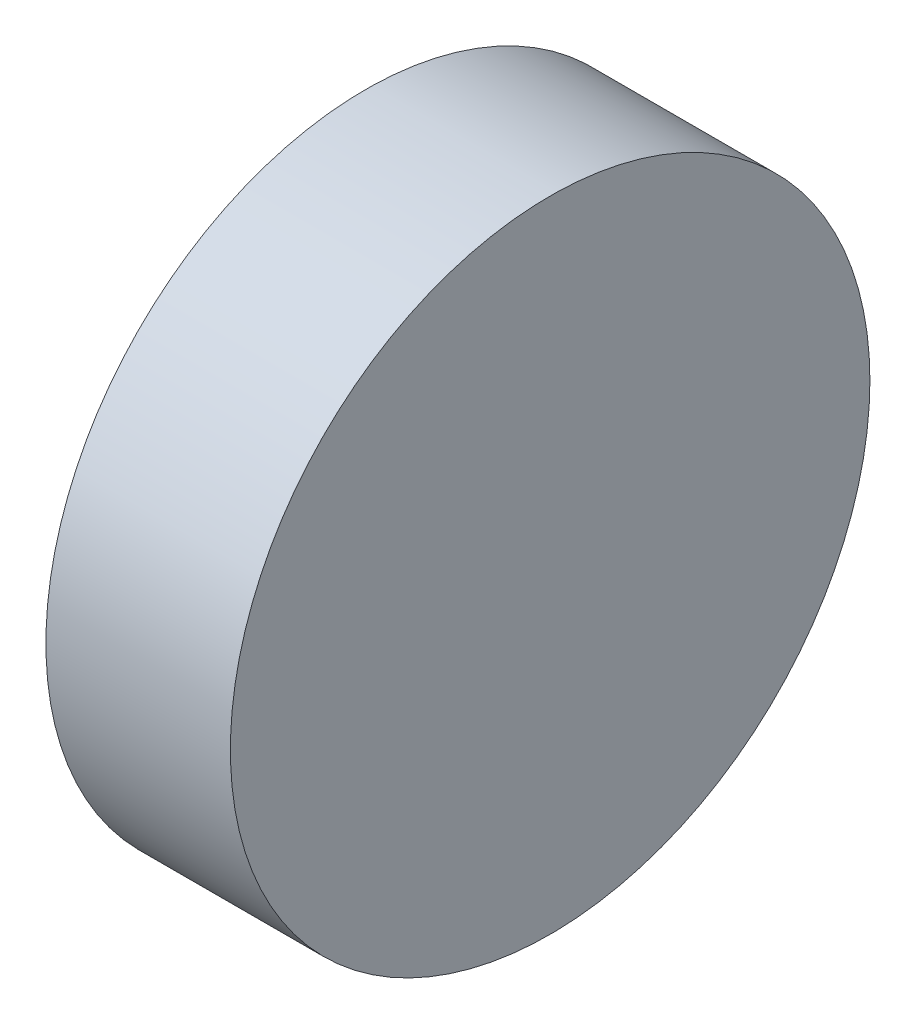
ISO-10303-21;
HEADER;
FILE_DESCRIPTION(('STEP AP214'),'2;1');
FILE_NAME('part.step','',(''),(''),'','','');
FILE_SCHEMA(('AUTOMOTIVE_DESIGN { 1 0 10303 214 1 1 1 1 }'));
ENDSEC;
DATA;
#1=APPLICATION_CONTEXT('core data for automotive mechanical design processes');
#2=APPLICATION_PROTOCOL_DEFINITION('international standard','automotive_design',2000,#1);
#3=PRODUCT_CONTEXT('',#1,'mechanical');
#4=PRODUCT('Part','Part','',(#3));
#5=PRODUCT_RELATED_PRODUCT_CATEGORY('part','',(#4));
#6=PRODUCT_DEFINITION_FORMATION('','',#4);
#7=PRODUCT_DEFINITION_CONTEXT('part definition',#1,'design');
#8=PRODUCT_DEFINITION('design','',#6,#7);
#9=PRODUCT_DEFINITION_SHAPE('','',#8);
#10=(LENGTH_UNIT() NAMED_UNIT(*) SI_UNIT(.MILLI.,.METRE.));
#11=(NAMED_UNIT(*) PLANE_ANGLE_UNIT() SI_UNIT($,.RADIAN.));
#12=(NAMED_UNIT(*) SI_UNIT($,.STERADIAN.) SOLID_ANGLE_UNIT());
#13=UNCERTAINTY_MEASURE_WITH_UNIT(LENGTH_MEASURE(1.E-05),#10,'distance_accuracy_value','');
#14=(GEOMETRIC_REPRESENTATION_CONTEXT(3) GLOBAL_UNCERTAINTY_ASSIGNED_CONTEXT((#13)) GLOBAL_UNIT_ASSIGNED_CONTEXT((#10,
#11,#12)) REPRESENTATION_CONTEXT('',''));
#15=CARTESIAN_POINT('',(0.,0.,0.));
#16=DIRECTION('',(0.,0.,1.));
#17=DIRECTION('',(1.,0.,0.));
#18=AXIS2_PLACEMENT_3D('',#15,#16,#17);
#19=CARTESIAN_POINT('',(31.65,0.,-25.));
#20=DIRECTION('',(1.,0.,0.));
#21=DIRECTION('',(0.,0.,-1.));
#22=AXIS2_PLACEMENT_3D('',#19,#20,#21);
#23=PLANE('',#22);
#24=CARTESIAN_POINT('',(31.65,0.,-25.));
#25=DIRECTION('',(1.,0.,0.));
#26=DIRECTION('',(0.,0.,-1.));
#27=AXIS2_PLACEMENT_3D('',#24,#25,#26);
#28=CIRCLE('',#27,2.6);
#29=CARTESIAN_POINT('',(31.65,0.,-27.6));
#30=VERTEX_POINT('',#29);
#31=EDGE_CURVE('E9',#30,#30,#28,.T.);
#32=ORIENTED_EDGE('',*,*,#31,.F.);
#33=EDGE_LOOP('',(#32));
#34=FACE_BOUND('',#33,.T.);
#35=ADVANCED_FACE('F14',(#34),#23,.F.);
#36=CARTESIAN_POINT('',(33.15,0.,-25.));
#37=DIRECTION('',(1.,0.,0.));
#38=DIRECTION('',(0.,0.,-1.));
#39=AXIS2_PLACEMENT_3D('',#36,#37,#38);
#40=PLANE('',#39);
#41=CARTESIAN_POINT('',(33.15,0.,-25.));
#42=DIRECTION('',(1.,0.,0.));
#43=DIRECTION('',(0.,0.,-1.));
#44=AXIS2_PLACEMENT_3D('',#41,#42,#43);
#45=CIRCLE('',#44,2.6);
#46=CARTESIAN_POINT('',(33.15,0.,-27.6));
#47=VERTEX_POINT('',#46);
#48=EDGE_CURVE('E21',#47,#47,#45,.T.);
#49=ORIENTED_EDGE('',*,*,#48,.T.);
#50=EDGE_LOOP('',(#49));
#51=FACE_BOUND('',#50,.T.);
#52=ADVANCED_FACE('F34',(#51),#40,.T.);
#53=CARTESIAN_POINT('',(31.65,0.,-25.));
#54=DIRECTION('',(1.,0.,0.));
#55=DIRECTION('',(0.,0.,-1.));
#56=AXIS2_PLACEMENT_3D('',#53,#54,#55);
#57=CYLINDRICAL_SURFACE('',#56,2.6);
#58=ORIENTED_EDGE('',*,*,#48,.F.);
#59=EDGE_LOOP('',(#58));
#60=FACE_BOUND('',#59,.T.);
#61=ORIENTED_EDGE('',*,*,#31,.T.);
#62=EDGE_LOOP('',(#61));
#63=FACE_BOUND('',#62,.T.);
#64=ADVANCED_FACE('F36',(#60,#63),#57,.T.);
#65=CLOSED_SHELL('',(#35,#52,#64));
#66=MANIFOLD_SOLID_BREP('B1',#65);
#67=ADVANCED_BREP_SHAPE_REPRESENTATION('',(#18,#66),#14);
#68=SHAPE_DEFINITION_REPRESENTATION(#9,#67);
ENDSEC;
END-ISO-10303-21;
